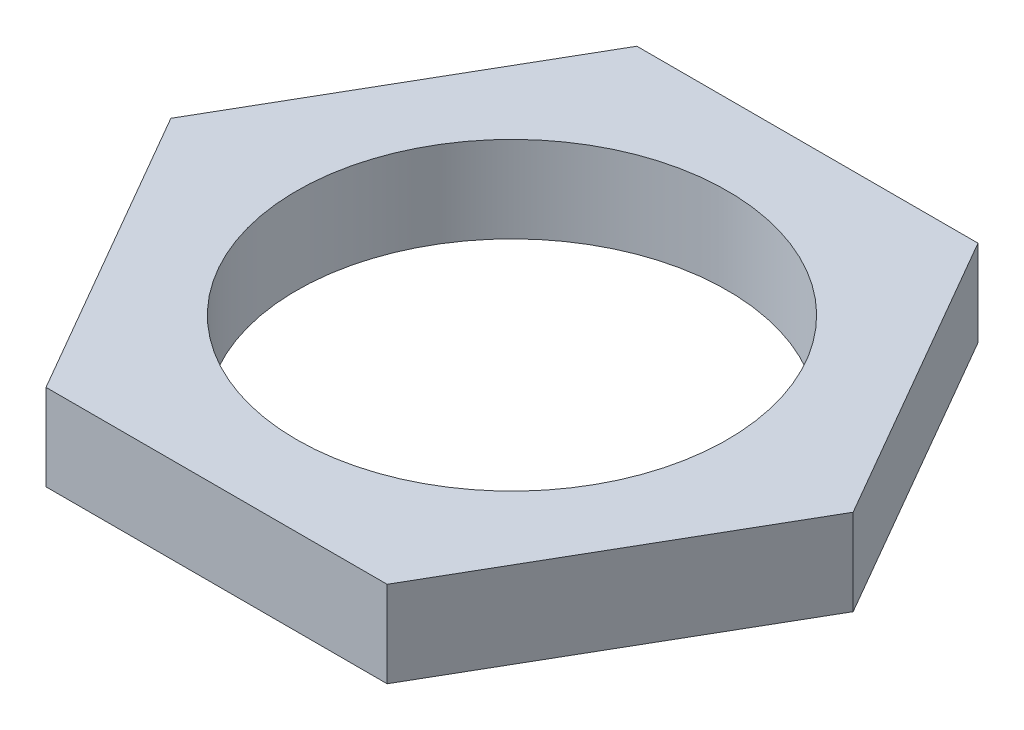
ISO-10303-21;
HEADER;
FILE_DESCRIPTION(('STEP AP214'),'2;1');
FILE_NAME('part.step','',(''),(''),'','','');
FILE_SCHEMA(('AUTOMOTIVE_DESIGN { 1 0 10303 214 1 1 1 1 }'));
ENDSEC;
DATA;
#1=APPLICATION_CONTEXT('core data for automotive mechanical design processes');
#2=APPLICATION_PROTOCOL_DEFINITION('international standard','automotive_design',2000,#1);
#3=PRODUCT_CONTEXT('',#1,'mechanical');
#4=PRODUCT('Part','Part','',(#3));
#5=PRODUCT_RELATED_PRODUCT_CATEGORY('part','',(#4));
#6=PRODUCT_DEFINITION_FORMATION('','',#4);
#7=PRODUCT_DEFINITION_CONTEXT('part definition',#1,'design');
#8=PRODUCT_DEFINITION('design','',#6,#7);
#9=PRODUCT_DEFINITION_SHAPE('','',#8);
#10=(LENGTH_UNIT() NAMED_UNIT(*) SI_UNIT(.MILLI.,.METRE.));
#11=(NAMED_UNIT(*) PLANE_ANGLE_UNIT() SI_UNIT($,.RADIAN.));
#12=(NAMED_UNIT(*) SI_UNIT($,.STERADIAN.) SOLID_ANGLE_UNIT());
#13=UNCERTAINTY_MEASURE_WITH_UNIT(LENGTH_MEASURE(1.E-05),#10,'distance_accuracy_value','');
#14=(GEOMETRIC_REPRESENTATION_CONTEXT(3) GLOBAL_UNCERTAINTY_ASSIGNED_CONTEXT((#13)) GLOBAL_UNIT_ASSIGNED_CONTEXT((#10,
#11,#12)) REPRESENTATION_CONTEXT('',''));
#15=CARTESIAN_POINT('',(0.,0.,0.));
#16=DIRECTION('',(0.,0.,1.));
#17=DIRECTION('',(1.,0.,0.));
#18=AXIS2_PLACEMENT_3D('',#15,#16,#17);
#19=CARTESIAN_POINT('',(0.,3.5,0.));
#20=DIRECTION('',(0.,1.,0.));
#21=DIRECTION('',(0.,0.,1.));
#22=AXIS2_PLACEMENT_3D('',#19,#20,#21);
#23=PLANE('',#22);
#24=DIRECTION('',(0.5,0.,0.866025403784438));
#25=VECTOR('',#24,1.);
#26=CARTESIAN_POINT('',(-13.856406460551,3.5,0.));
#27=LINE('',#26,#25);
#28=CARTESIAN_POINT('',(-13.856406460551,3.5,0.));
#29=VERTEX_POINT('',#28);
#30=CARTESIAN_POINT('',(-6.92820323027551,3.5,12.));
#31=VERTEX_POINT('',#30);
#32=EDGE_CURVE('E130',#29,#31,#27,.T.);
#33=ORIENTED_EDGE('',*,*,#32,.T.);
#34=DIRECTION('',(1.,0.,0.));
#35=VECTOR('',#34,1.);
#36=CARTESIAN_POINT('',(-6.92820323027551,3.5,12.));
#37=LINE('',#36,#35);
#38=CARTESIAN_POINT('',(6.92820323027551,3.5,12.));
#39=VERTEX_POINT('',#38);
#40=EDGE_CURVE('E88',#31,#39,#37,.T.);
#41=ORIENTED_EDGE('',*,*,#40,.T.);
#42=DIRECTION('',(0.5,0.,-0.866025403784439));
#43=VECTOR('',#42,1.);
#44=CARTESIAN_POINT('',(6.92820323027551,3.5,12.));
#45=LINE('',#44,#43);
#46=CARTESIAN_POINT('',(13.856406460551,3.5,0.));
#47=VERTEX_POINT('',#46);
#48=EDGE_CURVE('E101',#39,#47,#45,.T.);
#49=ORIENTED_EDGE('',*,*,#48,.T.);
#50=DIRECTION('',(-0.5,0.,-0.866025403784439));
#51=VECTOR('',#50,1.);
#52=CARTESIAN_POINT('',(13.856406460551,3.5,0.));
#53=LINE('',#52,#51);
#54=CARTESIAN_POINT('',(6.92820323027551,3.5,-12.));
#55=VERTEX_POINT('',#54);
#56=EDGE_CURVE('E95',#47,#55,#53,.T.);
#57=ORIENTED_EDGE('',*,*,#56,.T.);
#58=DIRECTION('',(-1.,0.,0.));
#59=VECTOR('',#58,1.);
#60=CARTESIAN_POINT('',(6.92820323027551,3.5,-12.));
#61=LINE('',#60,#59);
#62=CARTESIAN_POINT('',(-6.92820323027551,3.5,-12.));
#63=VERTEX_POINT('',#62);
#64=EDGE_CURVE('E99',#55,#63,#61,.T.);
#65=ORIENTED_EDGE('',*,*,#64,.T.);
#66=DIRECTION('',(-0.5,0.,0.866025403784439));
#67=VECTOR('',#66,1.);
#68=CARTESIAN_POINT('',(-6.92820323027551,3.5,-12.));
#69=LINE('',#68,#67);
#70=EDGE_CURVE('E51',#63,#29,#69,.T.);
#71=ORIENTED_EDGE('',*,*,#70,.T.);
#72=EDGE_LOOP('',(#33,#41,#49,#57,#65,#71));
#73=FACE_BOUND('',#72,.T.);
#74=CARTESIAN_POINT('',(0.,3.5,0.));
#75=DIRECTION('',(0.,1.,0.));
#76=DIRECTION('',(0.,0.,1.));
#77=AXIS2_PLACEMENT_3D('',#74,#75,#76);
#78=CIRCLE('',#77,8.75);
#79=CARTESIAN_POINT('',(0.,3.5,8.75));
#80=VERTEX_POINT('',#79);
#81=EDGE_CURVE('E123',#80,#80,#78,.T.);
#82=ORIENTED_EDGE('',*,*,#81,.F.);
#83=EDGE_LOOP('',(#82));
#84=FACE_BOUND('',#83,.T.);
#85=ADVANCED_FACE('F34',(#73,#84),#23,.T.);
#86=CARTESIAN_POINT('',(0.,0.,0.));
#87=DIRECTION('',(0.,1.,0.));
#88=DIRECTION('',(0.,0.,1.));
#89=AXIS2_PLACEMENT_3D('',#86,#87,#88);
#90=PLANE('',#89);
#91=DIRECTION('',(0.5,0.,0.866025403784438));
#92=VECTOR('',#91,1.);
#93=CARTESIAN_POINT('',(-13.856406460551,0.,0.));
#94=LINE('',#93,#92);
#95=CARTESIAN_POINT('',(-13.856406460551,0.,0.));
#96=VERTEX_POINT('',#95);
#97=CARTESIAN_POINT('',(-6.92820323027551,0.,12.));
#98=VERTEX_POINT('',#97);
#99=EDGE_CURVE('E119',#96,#98,#94,.T.);
#100=ORIENTED_EDGE('',*,*,#99,.F.);
#101=DIRECTION('',(-0.5,0.,0.866025403784439));
#102=VECTOR('',#101,1.);
#103=CARTESIAN_POINT('',(-6.92820323027551,0.,-12.));
#104=LINE('',#103,#102);
#105=CARTESIAN_POINT('',(-6.92820323027551,0.,-12.));
#106=VERTEX_POINT('',#105);
#107=EDGE_CURVE('E80',#106,#96,#104,.T.);
#108=ORIENTED_EDGE('',*,*,#107,.F.);
#109=DIRECTION('',(-1.,0.,0.));
#110=VECTOR('',#109,1.);
#111=CARTESIAN_POINT('',(6.92820323027551,0.,-12.));
#112=LINE('',#111,#110);
#113=CARTESIAN_POINT('',(6.92820323027551,0.,-12.));
#114=VERTEX_POINT('',#113);
#115=EDGE_CURVE('E74',#114,#106,#112,.T.);
#116=ORIENTED_EDGE('',*,*,#115,.F.);
#117=DIRECTION('',(-0.5,0.,-0.866025403784439));
#118=VECTOR('',#117,1.);
#119=CARTESIAN_POINT('',(13.856406460551,0.,0.));
#120=LINE('',#119,#118);
#121=CARTESIAN_POINT('',(13.856406460551,0.,0.));
#122=VERTEX_POINT('',#121);
#123=EDGE_CURVE('E109',#122,#114,#120,.T.);
#124=ORIENTED_EDGE('',*,*,#123,.F.);
#125=DIRECTION('',(0.5,0.,-0.866025403784439));
#126=VECTOR('',#125,1.);
#127=CARTESIAN_POINT('',(6.92820323027551,0.,12.));
#128=LINE('',#127,#126);
#129=CARTESIAN_POINT('',(6.92820323027551,0.,12.));
#130=VERTEX_POINT('',#129);
#131=EDGE_CURVE('E125',#130,#122,#128,.T.);
#132=ORIENTED_EDGE('',*,*,#131,.F.);
#133=DIRECTION('',(1.,0.,0.));
#134=VECTOR('',#133,1.);
#135=CARTESIAN_POINT('',(-6.92820323027551,0.,12.));
#136=LINE('',#135,#134);
#137=EDGE_CURVE('E122',#98,#130,#136,.T.);
#138=ORIENTED_EDGE('',*,*,#137,.F.);
#139=EDGE_LOOP('',(#100,#108,#116,#124,#132,#138));
#140=FACE_BOUND('',#139,.T.);
#141=CARTESIAN_POINT('',(0.,0.,0.));
#142=DIRECTION('',(0.,1.,0.));
#143=DIRECTION('',(0.,0.,1.));
#144=AXIS2_PLACEMENT_3D('',#141,#142,#143);
#145=CIRCLE('',#144,8.75);
#146=CARTESIAN_POINT('',(0.,0.,8.75));
#147=VERTEX_POINT('',#146);
#148=EDGE_CURVE('E223',#147,#147,#145,.T.);
#149=ORIENTED_EDGE('',*,*,#148,.T.);
#150=EDGE_LOOP('',(#149));
#151=FACE_BOUND('',#150,.T.);
#152=ADVANCED_FACE('F139',(#140,#151),#90,.F.);
#153=CARTESIAN_POINT('',(-13.856406460551,3.5,0.));
#154=DIRECTION('',(0.866025403784438,0.,-0.5));
#155=DIRECTION('',(-0.5,0.,-0.866025403784439));
#156=AXIS2_PLACEMENT_3D('',#153,#154,#155);
#157=PLANE('',#156);
#158=ORIENTED_EDGE('',*,*,#99,.T.);
#159=DIRECTION('',(0.,-1.,0.));
#160=VECTOR('',#159,1.);
#161=CARTESIAN_POINT('',(-6.92820323027551,3.5,12.));
#162=LINE('',#161,#160);
#163=EDGE_CURVE('E11',#31,#98,#162,.T.);
#164=ORIENTED_EDGE('',*,*,#163,.F.);
#165=ORIENTED_EDGE('',*,*,#32,.F.);
#166=DIRECTION('',(0.,-1.,0.));
#167=VECTOR('',#166,1.);
#168=CARTESIAN_POINT('',(-13.856406460551,3.5,0.));
#169=LINE('',#168,#167);
#170=EDGE_CURVE('E115',#29,#96,#169,.T.);
#171=ORIENTED_EDGE('',*,*,#170,.T.);
#172=EDGE_LOOP('',(#158,#164,#165,#171));
#173=FACE_BOUND('',#172,.T.);
#174=ADVANCED_FACE('F36',(#173),#157,.F.);
#175=CARTESIAN_POINT('',(-6.92820323027551,3.5,12.));
#176=DIRECTION('',(0.,0.,-1.));
#177=DIRECTION('',(-1.,0.,0.));
#178=AXIS2_PLACEMENT_3D('',#175,#176,#177);
#179=PLANE('',#178);
#180=ORIENTED_EDGE('',*,*,#137,.T.);
#181=DIRECTION('',(0.,-1.,0.));
#182=VECTOR('',#181,1.);
#183=CARTESIAN_POINT('',(6.92820323027551,3.5,12.));
#184=LINE('',#183,#182);
#185=EDGE_CURVE('E43',#39,#130,#184,.T.);
#186=ORIENTED_EDGE('',*,*,#185,.F.);
#187=ORIENTED_EDGE('',*,*,#40,.F.);
#188=ORIENTED_EDGE('',*,*,#163,.T.);
#189=EDGE_LOOP('',(#180,#186,#187,#188));
#190=FACE_BOUND('',#189,.T.);
#191=ADVANCED_FACE('F164',(#190),#179,.F.);
#192=CARTESIAN_POINT('',(6.92820323027551,3.5,12.));
#193=DIRECTION('',(-0.866025403784439,0.,-0.5));
#194=DIRECTION('',(-0.5,0.,0.866025403784439));
#195=AXIS2_PLACEMENT_3D('',#192,#193,#194);
#196=PLANE('',#195);
#197=ORIENTED_EDGE('',*,*,#131,.T.);
#198=DIRECTION('',(0.,-1.,0.));
#199=VECTOR('',#198,1.);
#200=CARTESIAN_POINT('',(13.856406460551,3.5,0.));
#201=LINE('',#200,#199);
#202=EDGE_CURVE('E110',#47,#122,#201,.T.);
#203=ORIENTED_EDGE('',*,*,#202,.F.);
#204=ORIENTED_EDGE('',*,*,#48,.F.);
#205=ORIENTED_EDGE('',*,*,#185,.T.);
#206=EDGE_LOOP('',(#197,#203,#204,#205));
#207=FACE_BOUND('',#206,.T.);
#208=ADVANCED_FACE('F136',(#207),#196,.F.);
#209=CARTESIAN_POINT('',(13.856406460551,3.5,0.));
#210=DIRECTION('',(-0.866025403784439,0.,0.5));
#211=DIRECTION('',(0.5,0.,0.866025403784439));
#212=AXIS2_PLACEMENT_3D('',#209,#210,#211);
#213=PLANE('',#212);
#214=ORIENTED_EDGE('',*,*,#123,.T.);
#215=DIRECTION('',(0.,-1.,0.));
#216=VECTOR('',#215,1.);
#217=CARTESIAN_POINT('',(6.92820323027551,3.5,-12.));
#218=LINE('',#217,#216);
#219=EDGE_CURVE('E106',#55,#114,#218,.T.);
#220=ORIENTED_EDGE('',*,*,#219,.F.);
#221=ORIENTED_EDGE('',*,*,#56,.F.);
#222=ORIENTED_EDGE('',*,*,#202,.T.);
#223=EDGE_LOOP('',(#214,#220,#221,#222));
#224=FACE_BOUND('',#223,.T.);
#225=ADVANCED_FACE('F107',(#224),#213,.F.);
#226=CARTESIAN_POINT('',(6.92820323027551,3.5,-12.));
#227=DIRECTION('',(0.,0.,1.));
#228=DIRECTION('',(1.,0.,0.));
#229=AXIS2_PLACEMENT_3D('',#226,#227,#228);
#230=PLANE('',#229);
#231=ORIENTED_EDGE('',*,*,#115,.T.);
#232=DIRECTION('',(0.,-1.,0.));
#233=VECTOR('',#232,1.);
#234=CARTESIAN_POINT('',(-6.92820323027551,3.5,-12.));
#235=LINE('',#234,#233);
#236=EDGE_CURVE('E111',#63,#106,#235,.T.);
#237=ORIENTED_EDGE('',*,*,#236,.F.);
#238=ORIENTED_EDGE('',*,*,#64,.F.);
#239=ORIENTED_EDGE('',*,*,#219,.T.);
#240=EDGE_LOOP('',(#231,#237,#238,#239));
#241=FACE_BOUND('',#240,.T.);
#242=ADVANCED_FACE('F113',(#241),#230,.F.);
#243=CARTESIAN_POINT('',(-6.92820323027551,3.5,-12.));
#244=DIRECTION('',(0.866025403784439,0.,0.5));
#245=DIRECTION('',(0.5,0.,-0.866025403784439));
#246=AXIS2_PLACEMENT_3D('',#243,#244,#245);
#247=PLANE('',#246);
#248=ORIENTED_EDGE('',*,*,#107,.T.);
#249=ORIENTED_EDGE('',*,*,#170,.F.);
#250=ORIENTED_EDGE('',*,*,#70,.F.);
#251=ORIENTED_EDGE('',*,*,#236,.T.);
#252=EDGE_LOOP('',(#248,#249,#250,#251));
#253=FACE_BOUND('',#252,.T.);
#254=ADVANCED_FACE('F144',(#253),#247,.F.);
#255=CARTESIAN_POINT('',(0.,3.5,0.));
#256=DIRECTION('',(0.,-1.,0.));
#257=DIRECTION('',(0.,0.,-1.));
#258=AXIS2_PLACEMENT_3D('',#255,#256,#257);
#259=CYLINDRICAL_SURFACE('',#258,8.75);
#260=ORIENTED_EDGE('',*,*,#81,.T.);
#261=EDGE_LOOP('',(#260));
#262=FACE_BOUND('',#261,.T.);
#263=ORIENTED_EDGE('',*,*,#148,.F.);
#264=EDGE_LOOP('',(#263));
#265=FACE_BOUND('',#264,.T.);
#266=ADVANCED_FACE('F146',(#262,#265),#259,.F.);
#267=CLOSED_SHELL('',(#85,#152,#174,#191,#208,#225,#242,#254,#266));
#268=MANIFOLD_SOLID_BREP('B2',#267);
#269=ADVANCED_BREP_SHAPE_REPRESENTATION('',(#18,#268),#14);
#270=SHAPE_DEFINITION_REPRESENTATION(#9,#269);
ENDSEC;
END-ISO-10303-21;
